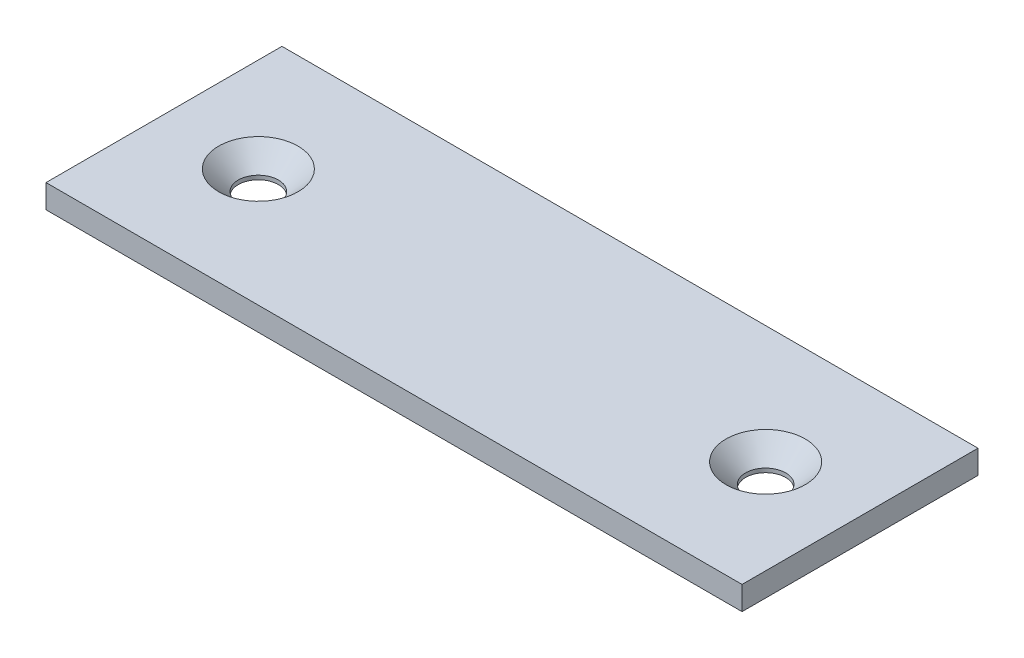
ISO-10303-21;
HEADER;
FILE_DESCRIPTION(('STEP AP214'),'2;1');
FILE_NAME('part.step','',(''),(''),'','','');
FILE_SCHEMA(('AUTOMOTIVE_DESIGN { 1 0 10303 214 1 1 1 1 }'));
ENDSEC;
DATA;
#1=APPLICATION_CONTEXT('core data for automotive mechanical design processes');
#2=APPLICATION_PROTOCOL_DEFINITION('international standard','automotive_design',2000,#1);
#3=PRODUCT_CONTEXT('',#1,'mechanical');
#4=PRODUCT('Part','Part','',(#3));
#5=PRODUCT_RELATED_PRODUCT_CATEGORY('part','',(#4));
#6=PRODUCT_DEFINITION_FORMATION('','',#4);
#7=PRODUCT_DEFINITION_CONTEXT('part definition',#1,'design');
#8=PRODUCT_DEFINITION('design','',#6,#7);
#9=PRODUCT_DEFINITION_SHAPE('','',#8);
#10=(LENGTH_UNIT() NAMED_UNIT(*) SI_UNIT(.MILLI.,.METRE.));
#11=(NAMED_UNIT(*) PLANE_ANGLE_UNIT() SI_UNIT($,.RADIAN.));
#12=(NAMED_UNIT(*) SI_UNIT($,.STERADIAN.) SOLID_ANGLE_UNIT());
#13=UNCERTAINTY_MEASURE_WITH_UNIT(LENGTH_MEASURE(1.E-05),#10,'distance_accuracy_value','');
#14=(GEOMETRIC_REPRESENTATION_CONTEXT(3) GLOBAL_UNCERTAINTY_ASSIGNED_CONTEXT((#13)) GLOBAL_UNIT_ASSIGNED_CONTEXT((#10,
#11,#12)) REPRESENTATION_CONTEXT('',''));
#15=CARTESIAN_POINT('',(0.,0.,0.));
#16=DIRECTION('',(0.,0.,1.));
#17=DIRECTION('',(1.,0.,0.));
#18=AXIS2_PLACEMENT_3D('',#15,#16,#17);
#19=CARTESIAN_POINT('',(29.5,0.,-10.));
#20=DIRECTION('',(-1.,0.,0.));
#21=DIRECTION('',(0.,0.,1.));
#22=AXIS2_PLACEMENT_3D('',#19,#20,#21);
#23=PLANE('',#22);
#24=DIRECTION('',(0.,0.,1.));
#25=VECTOR('',#24,1.);
#26=CARTESIAN_POINT('',(29.5,0.499999999999995,-10.));
#27=LINE('',#26,#25);
#28=CARTESIAN_POINT('',(29.5,0.499999999999995,-10.));
#29=VERTEX_POINT('',#28);
#30=CARTESIAN_POINT('',(29.5,0.499999999999995,10.));
#31=VERTEX_POINT('',#30);
#32=EDGE_CURVE('E40',#29,#31,#27,.T.);
#33=ORIENTED_EDGE('',*,*,#32,.T.);
#34=DIRECTION('',(0.,-1.,0.));
#35=VECTOR('',#34,1.);
#36=CARTESIAN_POINT('',(29.5,0.,10.));
#37=LINE('',#36,#35);
#38=CARTESIAN_POINT('',(29.5,-1.49999999999999,10.));
#39=VERTEX_POINT('',#38);
#40=EDGE_CURVE('E80',#31,#39,#37,.T.);
#41=ORIENTED_EDGE('',*,*,#40,.T.);
#42=DIRECTION('',(0.,0.,1.));
#43=VECTOR('',#42,1.);
#44=CARTESIAN_POINT('',(29.5,-1.49999999999999,-10.));
#45=LINE('',#44,#43);
#46=CARTESIAN_POINT('',(29.5,-1.49999999999999,-10.));
#47=VERTEX_POINT('',#46);
#48=EDGE_CURVE('E11',#47,#39,#45,.T.);
#49=ORIENTED_EDGE('',*,*,#48,.F.);
#50=DIRECTION('',(0.,-1.,0.));
#51=VECTOR('',#50,1.);
#52=CARTESIAN_POINT('',(29.5,0.,-10.));
#53=LINE('',#52,#51);
#54=EDGE_CURVE('E53',#29,#47,#53,.T.);
#55=ORIENTED_EDGE('',*,*,#54,.F.);
#56=EDGE_LOOP('',(#33,#41,#49,#55));
#57=FACE_BOUND('',#56,.T.);
#58=ADVANCED_FACE('F37',(#57),#23,.F.);
#59=CARTESIAN_POINT('',(0.,-1.5,-10.));
#60=DIRECTION('',(0.,-1.,0.));
#61=DIRECTION('',(1.,0.,0.));
#62=AXIS2_PLACEMENT_3D('',#59,#60,#61);
#63=PLANE('',#62);
#64=CARTESIAN_POINT('',(-21.5,-1.50000000000001,0.));
#65=DIRECTION('',(0.,1.,0.));
#66=DIRECTION('',(0.,0.,1.));
#67=AXIS2_PLACEMENT_3D('',#64,#65,#66);
#68=CIRCLE('',#67,1.7);
#69=CARTESIAN_POINT('',(-21.5,-1.50000000000001,1.7));
#70=VERTEX_POINT('',#69);
#71=EDGE_CURVE('E136',#70,#70,#68,.T.);
#72=ORIENTED_EDGE('',*,*,#71,.T.);
#73=EDGE_LOOP('',(#72));
#74=FACE_BOUND('',#73,.T.);
#75=CARTESIAN_POINT('',(21.5,-1.50000000000001,0.));
#76=DIRECTION('',(0.,1.,0.));
#77=DIRECTION('',(0.,0.,1.));
#78=AXIS2_PLACEMENT_3D('',#75,#76,#77);
#79=CIRCLE('',#78,1.7);
#80=CARTESIAN_POINT('',(21.5,-1.50000000000001,1.7));
#81=VERTEX_POINT('',#80);
#82=EDGE_CURVE('E93',#81,#81,#79,.T.);
#83=ORIENTED_EDGE('',*,*,#82,.T.);
#84=EDGE_LOOP('',(#83));
#85=FACE_BOUND('',#84,.T.);
#86=ORIENTED_EDGE('',*,*,#48,.T.);
#87=DIRECTION('',(1.,0.,0.));
#88=VECTOR('',#87,1.);
#89=CARTESIAN_POINT('',(0.,-1.5,10.));
#90=LINE('',#89,#88);
#91=CARTESIAN_POINT('',(-29.5,-1.5,10.));
#92=VERTEX_POINT('',#91);
#93=EDGE_CURVE('E92',#92,#39,#90,.T.);
#94=ORIENTED_EDGE('',*,*,#93,.F.);
#95=DIRECTION('',(0.,0.,1.));
#96=VECTOR('',#95,1.);
#97=CARTESIAN_POINT('',(-29.5,-1.5,-10.));
#98=LINE('',#97,#96);
#99=CARTESIAN_POINT('',(-29.5,-1.5,-10.));
#100=VERTEX_POINT('',#99);
#101=EDGE_CURVE('E45',#100,#92,#98,.T.);
#102=ORIENTED_EDGE('',*,*,#101,.F.);
#103=DIRECTION('',(1.,0.,0.));
#104=VECTOR('',#103,1.);
#105=CARTESIAN_POINT('',(0.,-1.5,-10.));
#106=LINE('',#105,#104);
#107=EDGE_CURVE('E85',#100,#47,#106,.T.);
#108=ORIENTED_EDGE('',*,*,#107,.T.);
#109=EDGE_LOOP('',(#86,#94,#102,#108));
#110=FACE_BOUND('',#109,.T.);
#111=ADVANCED_FACE('F112',(#74,#85,#110),#63,.T.);
#112=CARTESIAN_POINT('',(-29.5,0.,-10.));
#113=DIRECTION('',(-1.,0.,0.));
#114=DIRECTION('',(0.,0.,1.));
#115=AXIS2_PLACEMENT_3D('',#112,#113,#114);
#116=PLANE('',#115);
#117=ORIENTED_EDGE('',*,*,#101,.T.);
#118=DIRECTION('',(0.,-1.,0.));
#119=VECTOR('',#118,1.);
#120=CARTESIAN_POINT('',(-29.5,0.,10.));
#121=LINE('',#120,#119);
#122=CARTESIAN_POINT('',(-29.5,0.499999999999995,10.));
#123=VERTEX_POINT('',#122);
#124=EDGE_CURVE('E97',#123,#92,#121,.T.);
#125=ORIENTED_EDGE('',*,*,#124,.F.);
#126=DIRECTION('',(0.,0.,1.));
#127=VECTOR('',#126,1.);
#128=CARTESIAN_POINT('',(-29.5,0.499999999999995,-10.));
#129=LINE('',#128,#127);
#130=CARTESIAN_POINT('',(-29.5,0.499999999999995,-10.));
#131=VERTEX_POINT('',#130);
#132=EDGE_CURVE('E84',#131,#123,#129,.T.);
#133=ORIENTED_EDGE('',*,*,#132,.F.);
#134=DIRECTION('',(0.,-1.,0.));
#135=VECTOR('',#134,1.);
#136=CARTESIAN_POINT('',(-29.5,0.,-10.));
#137=LINE('',#136,#135);
#138=EDGE_CURVE('E106',#131,#100,#137,.T.);
#139=ORIENTED_EDGE('',*,*,#138,.T.);
#140=EDGE_LOOP('',(#117,#125,#133,#139));
#141=FACE_BOUND('',#140,.T.);
#142=ADVANCED_FACE('F110',(#141),#116,.T.);
#143=CARTESIAN_POINT('',(0.,0.499999999999995,-10.));
#144=DIRECTION('',(0.,-1.,0.));
#145=DIRECTION('',(1.,0.,0.));
#146=AXIS2_PLACEMENT_3D('',#143,#144,#145);
#147=PLANE('',#146);
#148=CARTESIAN_POINT('',(-21.5,0.499999999999993,0.));
#149=DIRECTION('',(0.,1.,0.));
#150=DIRECTION('',(0.,0.,1.));
#151=AXIS2_PLACEMENT_3D('',#148,#149,#150);
#152=CIRCLE('',#151,3.36);
#153=CARTESIAN_POINT('',(-21.5,0.499999999999993,3.36));
#154=VERTEX_POINT('',#153);
#155=EDGE_CURVE('E151',#154,#154,#152,.T.);
#156=ORIENTED_EDGE('',*,*,#155,.F.);
#157=EDGE_LOOP('',(#156));
#158=FACE_BOUND('',#157,.T.);
#159=CARTESIAN_POINT('',(21.5,0.500000000000001,0.));
#160=DIRECTION('',(0.,1.,0.));
#161=DIRECTION('',(0.,0.,1.));
#162=AXIS2_PLACEMENT_3D('',#159,#160,#161);
#163=CIRCLE('',#162,3.36);
#164=CARTESIAN_POINT('',(21.5,0.500000000000001,3.36));
#165=VERTEX_POINT('',#164);
#166=EDGE_CURVE('E142',#165,#165,#163,.T.);
#167=ORIENTED_EDGE('',*,*,#166,.F.);
#168=EDGE_LOOP('',(#167));
#169=FACE_BOUND('',#168,.T.);
#170=ORIENTED_EDGE('',*,*,#132,.T.);
#171=DIRECTION('',(1.,0.,0.));
#172=VECTOR('',#171,1.);
#173=CARTESIAN_POINT('',(0.,0.499999999999995,10.));
#174=LINE('',#173,#172);
#175=EDGE_CURVE('E91',#123,#31,#174,.T.);
#176=ORIENTED_EDGE('',*,*,#175,.T.);
#177=ORIENTED_EDGE('',*,*,#32,.F.);
#178=DIRECTION('',(1.,0.,0.));
#179=VECTOR('',#178,1.);
#180=CARTESIAN_POINT('',(0.,0.499999999999995,-10.));
#181=LINE('',#180,#179);
#182=EDGE_CURVE('E104',#131,#29,#181,.T.);
#183=ORIENTED_EDGE('',*,*,#182,.F.);
#184=EDGE_LOOP('',(#170,#176,#177,#183));
#185=FACE_BOUND('',#184,.T.);
#186=ADVANCED_FACE('F95',(#158,#169,#185),#147,.F.);
#187=CARTESIAN_POINT('',(0.,0.,-10.));
#188=DIRECTION('',(0.,0.,1.));
#189=DIRECTION('',(1.,0.,0.));
#190=AXIS2_PLACEMENT_3D('',#187,#188,#189);
#191=PLANE('',#190);
#192=ORIENTED_EDGE('',*,*,#54,.T.);
#193=ORIENTED_EDGE('',*,*,#107,.F.);
#194=ORIENTED_EDGE('',*,*,#138,.F.);
#195=ORIENTED_EDGE('',*,*,#182,.T.);
#196=EDGE_LOOP('',(#192,#193,#194,#195));
#197=FACE_BOUND('',#196,.T.);
#198=ADVANCED_FACE('F113',(#197),#191,.F.);
#199=CARTESIAN_POINT('',(0.,0.,10.));
#200=DIRECTION('',(0.,0.,1.));
#201=DIRECTION('',(1.,0.,0.));
#202=AXIS2_PLACEMENT_3D('',#199,#200,#201);
#203=PLANE('',#202);
#204=ORIENTED_EDGE('',*,*,#40,.F.);
#205=ORIENTED_EDGE('',*,*,#175,.F.);
#206=ORIENTED_EDGE('',*,*,#124,.T.);
#207=ORIENTED_EDGE('',*,*,#93,.T.);
#208=EDGE_LOOP('',(#204,#205,#206,#207));
#209=FACE_BOUND('',#208,.T.);
#210=ADVANCED_FACE('F89',(#209),#203,.T.);
#211=CARTESIAN_POINT('',(21.5,0.499999999999999,0.));
#212=DIRECTION('',(0.,1.,0.));
#213=DIRECTION('',(0.,0.,1.));
#214=AXIS2_PLACEMENT_3D('',#211,#212,#213);
#215=CYLINDRICAL_SURFACE('',#214,1.7);
#216=ORIENTED_EDGE('',*,*,#82,.F.);
#217=EDGE_LOOP('',(#216));
#218=FACE_BOUND('',#217,.T.);
#219=CARTESIAN_POINT('',(21.5,-1.16,0.));
#220=DIRECTION('',(0.,1.,0.));
#221=DIRECTION('',(0.,0.,1.));
#222=AXIS2_PLACEMENT_3D('',#219,#220,#221);
#223=CIRCLE('',#222,1.7);
#224=CARTESIAN_POINT('',(21.5,-1.16,1.7));
#225=VERTEX_POINT('',#224);
#226=EDGE_CURVE('E140',#225,#225,#223,.T.);
#227=ORIENTED_EDGE('',*,*,#226,.T.);
#228=EDGE_LOOP('',(#227));
#229=FACE_BOUND('',#228,.T.);
#230=ADVANCED_FACE('F120',(#218,#229),#215,.F.);
#231=CARTESIAN_POINT('',(21.5,0.500000000000001,0.));
#232=DIRECTION('',(0.,1.,0.));
#233=DIRECTION('',(0.,0.,1.));
#234=AXIS2_PLACEMENT_3D('',#231,#232,#233);
#235=CONICAL_SURFACE('',#234,3.36,0.785398163397448);
#236=ORIENTED_EDGE('',*,*,#226,.F.);
#237=EDGE_LOOP('',(#236));
#238=FACE_BOUND('',#237,.T.);
#239=ORIENTED_EDGE('',*,*,#166,.T.);
#240=EDGE_LOOP('',(#239));
#241=FACE_BOUND('',#240,.T.);
#242=ADVANCED_FACE('F159',(#238,#241),#235,.F.);
#243=CARTESIAN_POINT('',(-21.5,0.499999999999991,0.));
#244=DIRECTION('',(0.,1.,0.));
#245=DIRECTION('',(0.,0.,1.));
#246=AXIS2_PLACEMENT_3D('',#243,#244,#245);
#247=CYLINDRICAL_SURFACE('',#246,1.7);
#248=ORIENTED_EDGE('',*,*,#71,.F.);
#249=EDGE_LOOP('',(#248));
#250=FACE_BOUND('',#249,.T.);
#251=CARTESIAN_POINT('',(-21.5,-1.16000000000001,0.));
#252=DIRECTION('',(0.,1.,0.));
#253=DIRECTION('',(0.,0.,1.));
#254=AXIS2_PLACEMENT_3D('',#251,#252,#253);
#255=CIRCLE('',#254,1.7);
#256=CARTESIAN_POINT('',(-21.5,-1.16000000000001,1.7));
#257=VERTEX_POINT('',#256);
#258=EDGE_CURVE('E148',#257,#257,#255,.T.);
#259=ORIENTED_EDGE('',*,*,#258,.T.);
#260=EDGE_LOOP('',(#259));
#261=FACE_BOUND('',#260,.T.);
#262=ADVANCED_FACE('F161',(#250,#261),#247,.F.);
#263=CARTESIAN_POINT('',(-21.5,0.499999999999993,0.));
#264=DIRECTION('',(0.,1.,0.));
#265=DIRECTION('',(0.,0.,1.));
#266=AXIS2_PLACEMENT_3D('',#263,#264,#265);
#267=CONICAL_SURFACE('',#266,3.36,0.785398163397448);
#268=ORIENTED_EDGE('',*,*,#258,.F.);
#269=EDGE_LOOP('',(#268));
#270=FACE_BOUND('',#269,.T.);
#271=ORIENTED_EDGE('',*,*,#155,.T.);
#272=EDGE_LOOP('',(#271));
#273=FACE_BOUND('',#272,.T.);
#274=ADVANCED_FACE('F155',(#270,#273),#267,.F.);
#275=CLOSED_SHELL('',(#58,#111,#142,#186,#198,#210,#230,#242,#262,#274));
#276=MANIFOLD_SOLID_BREP('B2',#275);
#277=ADVANCED_BREP_SHAPE_REPRESENTATION('',(#18,#276),#14);
#278=SHAPE_DEFINITION_REPRESENTATION(#9,#277);
ENDSEC;
END-ISO-10303-21;
